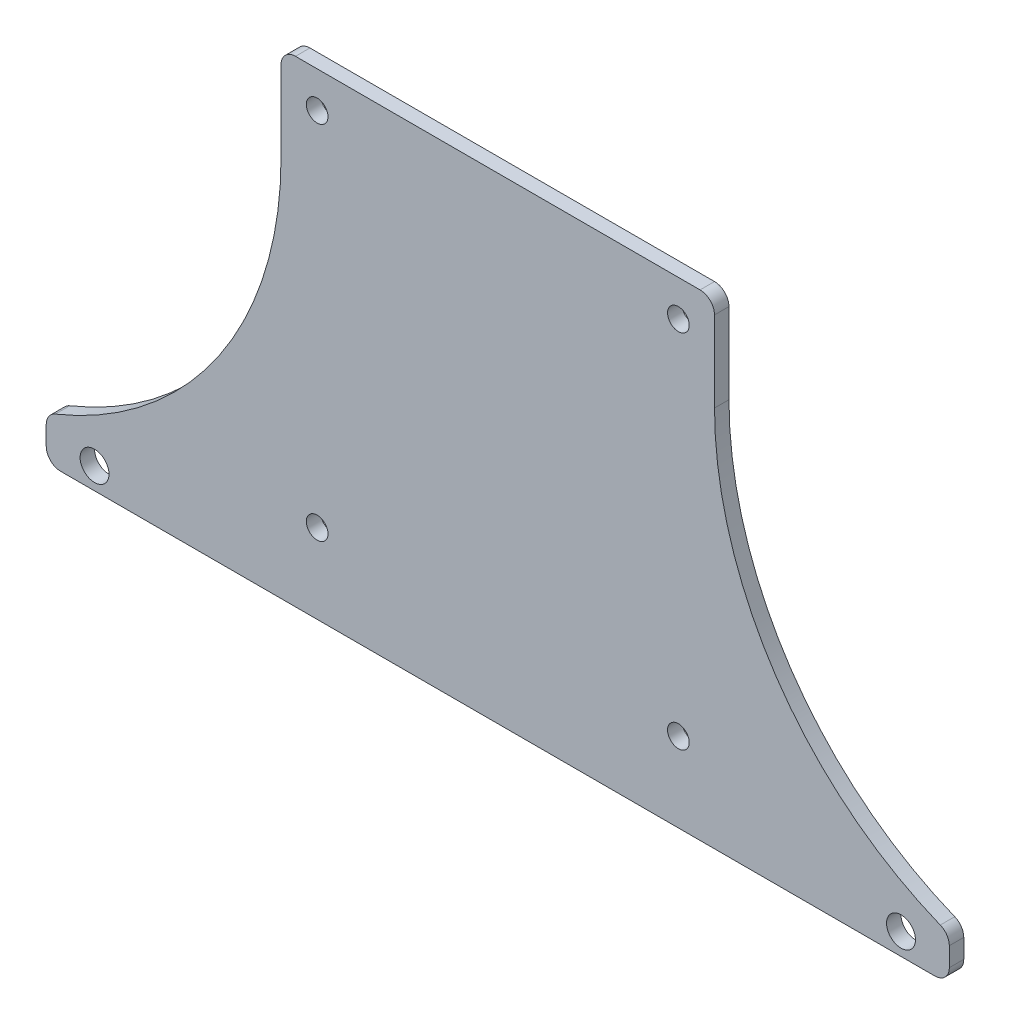
ISO-10303-21;
HEADER;
FILE_DESCRIPTION(('STEP AP214'),'2;1');
FILE_NAME('part.step','',(''),(''),'','','');
FILE_SCHEMA(('AUTOMOTIVE_DESIGN { 1 0 10303 214 1 1 1 1 }'));
ENDSEC;
DATA;
#1=APPLICATION_CONTEXT('core data for automotive mechanical design processes');
#2=APPLICATION_PROTOCOL_DEFINITION('international standard','automotive_design',2000,#1);
#3=PRODUCT_CONTEXT('',#1,'mechanical');
#4=PRODUCT('Part','Part','',(#3));
#5=PRODUCT_RELATED_PRODUCT_CATEGORY('part','',(#4));
#6=PRODUCT_DEFINITION_FORMATION('','',#4);
#7=PRODUCT_DEFINITION_CONTEXT('part definition',#1,'design');
#8=PRODUCT_DEFINITION('design','',#6,#7);
#9=PRODUCT_DEFINITION_SHAPE('','',#8);
#10=(LENGTH_UNIT() NAMED_UNIT(*) SI_UNIT(.MILLI.,.METRE.));
#11=(NAMED_UNIT(*) PLANE_ANGLE_UNIT() SI_UNIT($,.RADIAN.));
#12=(NAMED_UNIT(*) SI_UNIT($,.STERADIAN.) SOLID_ANGLE_UNIT());
#13=UNCERTAINTY_MEASURE_WITH_UNIT(LENGTH_MEASURE(1.E-05),#10,'distance_accuracy_value','');
#14=(GEOMETRIC_REPRESENTATION_CONTEXT(3) GLOBAL_UNCERTAINTY_ASSIGNED_CONTEXT((#13)) GLOBAL_UNIT_ASSIGNED_CONTEXT((#10,
#11,#12)) REPRESENTATION_CONTEXT('',''));
#15=CARTESIAN_POINT('',(0.,0.,0.));
#16=DIRECTION('',(0.,0.,1.));
#17=DIRECTION('',(1.,0.,0.));
#18=AXIS2_PLACEMENT_3D('',#15,#16,#17);
#19=CARTESIAN_POINT('',(0.,0.,2.));
#20=DIRECTION('',(0.,0.,-1.));
#21=DIRECTION('',(-1.,0.,0.));
#22=AXIS2_PLACEMENT_3D('',#19,#20,#21);
#23=PLANE('',#22);
#24=DIRECTION('',(-1.,0.,0.));
#25=VECTOR('',#24,1.);
#26=CARTESIAN_POINT('',(0.,60.,2.));
#27=LINE('',#26,#25);
#28=CARTESIAN_POINT('',(58.,60.,2.));
#29=VERTEX_POINT('',#28);
#30=CARTESIAN_POINT('',(2.,60.,2.));
#31=VERTEX_POINT('',#30);
#32=EDGE_CURVE('E157',#29,#31,#27,.T.);
#33=ORIENTED_EDGE('',*,*,#32,.T.);
#34=CARTESIAN_POINT('',(2.,58.,2.));
#35=DIRECTION('',(0.,0.,-1.));
#36=DIRECTION('',(-1.,0.,0.));
#37=AXIS2_PLACEMENT_3D('',#34,#35,#36);
#38=CIRCLE('',#37,2.);
#39=CARTESIAN_POINT('',(0.,58.,2.));
#40=VERTEX_POINT('',#39);
#41=EDGE_CURVE('E211',#31,#40,#38,.F.);
#42=ORIENTED_EDGE('',*,*,#41,.T.);
#43=DIRECTION('',(0.,-1.,0.));
#44=VECTOR('',#43,1.);
#45=CARTESIAN_POINT('',(0.,0.,2.));
#46=LINE('',#45,#44);
#47=CARTESIAN_POINT('',(0.,46.837484987988,2.));
#48=VERTEX_POINT('',#47);
#49=EDGE_CURVE('E168',#40,#48,#46,.T.);
#50=ORIENTED_EDGE('',*,*,#49,.T.);
#51=CARTESIAN_POINT('',(-50.,46.837484987988,2.));
#52=DIRECTION('',(0.,0.,-1.));
#53=DIRECTION('',(-1.,0.,0.));
#54=AXIS2_PLACEMENT_3D('',#51,#52,#53);
#55=CIRCLE('',#54,50.);
#56=CARTESIAN_POINT('',(-31.25,0.486244443640094,2.));
#57=VERTEX_POINT('',#56);
#58=EDGE_CURVE('E180',#48,#57,#55,.T.);
#59=ORIENTED_EDGE('',*,*,#58,.T.);
#60=CARTESIAN_POINT('',(-30.5,-1.36780517813383,2.));
#61=DIRECTION('',(0.,0.,-1.));
#62=DIRECTION('',(-1.,0.,0.));
#63=AXIS2_PLACEMENT_3D('',#60,#61,#62);
#64=CIRCLE('',#63,2.);
#65=CARTESIAN_POINT('',(-32.5,-1.36780517813383,2.));
#66=VERTEX_POINT('',#65);
#67=EDGE_CURVE('E202',#57,#66,#64,.F.);
#68=ORIENTED_EDGE('',*,*,#67,.T.);
#69=DIRECTION('',(0.,-1.,0.));
#70=VECTOR('',#69,1.);
#71=CARTESIAN_POINT('',(-32.5,-6.,2.));
#72=LINE('',#71,#70);
#73=CARTESIAN_POINT('',(-32.5,-4.,2.));
#74=VERTEX_POINT('',#73);
#75=EDGE_CURVE('E233',#66,#74,#72,.T.);
#76=ORIENTED_EDGE('',*,*,#75,.T.);
#77=CARTESIAN_POINT('',(-30.5,-4.,2.));
#78=DIRECTION('',(0.,0.,-1.));
#79=DIRECTION('',(-1.,0.,0.));
#80=AXIS2_PLACEMENT_3D('',#77,#78,#79);
#81=CIRCLE('',#80,2.);
#82=CARTESIAN_POINT('',(-30.5,-6.,2.));
#83=VERTEX_POINT('',#82);
#84=EDGE_CURVE('E204',#74,#83,#81,.F.);
#85=ORIENTED_EDGE('',*,*,#84,.T.);
#86=DIRECTION('',(1.,0.,0.));
#87=VECTOR('',#86,1.);
#88=CARTESIAN_POINT('',(-32.5,-6.,2.));
#89=LINE('',#88,#87);
#90=CARTESIAN_POINT('',(90.5,-5.99999999999998,2.));
#91=VERTEX_POINT('',#90);
#92=EDGE_CURVE('E243',#83,#91,#89,.T.);
#93=ORIENTED_EDGE('',*,*,#92,.T.);
#94=CARTESIAN_POINT('',(90.5,-3.99999999999998,2.));
#95=DIRECTION('',(0.,0.,-1.));
#96=DIRECTION('',(-1.,0.,0.));
#97=AXIS2_PLACEMENT_3D('',#94,#95,#96);
#98=CIRCLE('',#97,2.);
#99=CARTESIAN_POINT('',(92.5,-3.99999999999998,2.));
#100=VERTEX_POINT('',#99);
#101=EDGE_CURVE('E207',#91,#100,#98,.F.);
#102=ORIENTED_EDGE('',*,*,#101,.T.);
#103=DIRECTION('',(0.,1.,0.));
#104=VECTOR('',#103,1.);
#105=CARTESIAN_POINT('',(92.5,-5.99999999999998,2.));
#106=LINE('',#105,#104);
#107=CARTESIAN_POINT('',(92.5,-1.36780517813381,2.));
#108=VERTEX_POINT('',#107);
#109=EDGE_CURVE('E246',#100,#108,#106,.T.);
#110=ORIENTED_EDGE('',*,*,#109,.T.);
#111=CARTESIAN_POINT('',(90.5,-1.36780517813381,2.));
#112=DIRECTION('',(0.,0.,-1.));
#113=DIRECTION('',(-1.,0.,0.));
#114=AXIS2_PLACEMENT_3D('',#111,#112,#113);
#115=CIRCLE('',#114,2.);
#116=CARTESIAN_POINT('',(91.25,0.486244443640108,2.));
#117=VERTEX_POINT('',#116);
#118=EDGE_CURVE('E62',#108,#117,#115,.F.);
#119=ORIENTED_EDGE('',*,*,#118,.T.);
#120=CARTESIAN_POINT('',(110.,46.837484987988,2.));
#121=DIRECTION('',(0.,0.,-1.));
#122=DIRECTION('',(-1.,0.,0.));
#123=AXIS2_PLACEMENT_3D('',#120,#121,#122);
#124=CIRCLE('',#123,50.);
#125=CARTESIAN_POINT('',(60.,46.837484987988,2.));
#126=VERTEX_POINT('',#125);
#127=EDGE_CURVE('E151',#117,#126,#124,.T.);
#128=ORIENTED_EDGE('',*,*,#127,.T.);
#129=DIRECTION('',(0.,1.,0.));
#130=VECTOR('',#129,1.);
#131=CARTESIAN_POINT('',(60.,0.,2.));
#132=LINE('',#131,#130);
#133=CARTESIAN_POINT('',(60.,58.,2.));
#134=VERTEX_POINT('',#133);
#135=EDGE_CURVE('E156',#126,#134,#132,.T.);
#136=ORIENTED_EDGE('',*,*,#135,.T.);
#137=CARTESIAN_POINT('',(58.,58.,2.));
#138=DIRECTION('',(0.,0.,-1.));
#139=DIRECTION('',(-1.,0.,0.));
#140=AXIS2_PLACEMENT_3D('',#137,#138,#139);
#141=CIRCLE('',#140,2.);
#142=EDGE_CURVE('E209',#134,#29,#141,.F.);
#143=ORIENTED_EDGE('',*,*,#142,.T.);
#144=EDGE_LOOP('',(#33,#42,#50,#59,#68,#76,#85,#93,#102,#110,#119,#128,#136,#143));
#145=FACE_BOUND('',#144,.T.);
#146=CARTESIAN_POINT('',(5.,55.,2.));
#147=DIRECTION('',(0.,0.,1.));
#148=DIRECTION('',(1.,0.,0.));
#149=AXIS2_PLACEMENT_3D('',#146,#147,#148);
#150=CIRCLE('',#149,1.5);
#151=CARTESIAN_POINT('',(6.5,55.,2.));
#152=VERTEX_POINT('',#151);
#153=EDGE_CURVE('E171',#152,#152,#150,.T.);
#154=ORIENTED_EDGE('',*,*,#153,.F.);
#155=EDGE_LOOP('',(#154));
#156=FACE_BOUND('',#155,.T.);
#157=CARTESIAN_POINT('',(55.,55.,2.));
#158=DIRECTION('',(0.,0.,1.));
#159=DIRECTION('',(-1.,0.,0.));
#160=AXIS2_PLACEMENT_3D('',#157,#158,#159);
#161=CIRCLE('',#160,1.5);
#162=CARTESIAN_POINT('',(53.5,55.,2.));
#163=VERTEX_POINT('',#162);
#164=EDGE_CURVE('E269',#163,#163,#161,.T.);
#165=ORIENTED_EDGE('',*,*,#164,.F.);
#166=EDGE_LOOP('',(#165));
#167=FACE_BOUND('',#166,.T.);
#168=CARTESIAN_POINT('',(55.,5.00000000000001,2.));
#169=DIRECTION('',(0.,0.,1.));
#170=DIRECTION('',(1.,0.,0.));
#171=AXIS2_PLACEMENT_3D('',#168,#169,#170);
#172=CIRCLE('',#171,1.5);
#173=CARTESIAN_POINT('',(56.5,5.00000000000001,2.));
#174=VERTEX_POINT('',#173);
#175=EDGE_CURVE('E263',#174,#174,#172,.T.);
#176=ORIENTED_EDGE('',*,*,#175,.F.);
#177=EDGE_LOOP('',(#176));
#178=FACE_BOUND('',#177,.T.);
#179=CARTESIAN_POINT('',(5.,5.,2.));
#180=DIRECTION('',(0.,0.,1.));
#181=DIRECTION('',(-1.,0.,0.));
#182=AXIS2_PLACEMENT_3D('',#179,#180,#181);
#183=CIRCLE('',#182,1.5);
#184=CARTESIAN_POINT('',(3.5,5.,2.));
#185=VERTEX_POINT('',#184);
#186=EDGE_CURVE('E256',#185,#185,#183,.T.);
#187=ORIENTED_EDGE('',*,*,#186,.F.);
#188=EDGE_LOOP('',(#187));
#189=FACE_BOUND('',#188,.T.);
#190=CARTESIAN_POINT('',(85.815,-2.99999999999999,2.));
#191=DIRECTION('',(0.,0.,1.));
#192=DIRECTION('',(-1.,0.,0.));
#193=AXIS2_PLACEMENT_3D('',#190,#191,#192);
#194=CIRCLE('',#193,2.);
#195=CARTESIAN_POINT('',(83.815,-2.99999999999999,2.));
#196=VERTEX_POINT('',#195);
#197=EDGE_CURVE('E308',#196,#196,#194,.T.);
#198=ORIENTED_EDGE('',*,*,#197,.F.);
#199=EDGE_LOOP('',(#198));
#200=FACE_BOUND('',#199,.T.);
#201=CARTESIAN_POINT('',(-25.815,-3.,2.));
#202=DIRECTION('',(0.,0.,1.));
#203=DIRECTION('',(1.,0.,0.));
#204=AXIS2_PLACEMENT_3D('',#201,#202,#203);
#205=CIRCLE('',#204,2.);
#206=CARTESIAN_POINT('',(-23.815,-3.,2.));
#207=VERTEX_POINT('',#206);
#208=EDGE_CURVE('E249',#207,#207,#205,.T.);
#209=ORIENTED_EDGE('',*,*,#208,.F.);
#210=EDGE_LOOP('',(#209));
#211=FACE_BOUND('',#210,.T.);
#212=ADVANCED_FACE('F39',(#145,#156,#167,#178,#189,#200,#211),#23,.F.);
#213=CARTESIAN_POINT('',(0.,0.,0.));
#214=DIRECTION('',(0.,0.,-1.));
#215=DIRECTION('',(-1.,0.,0.));
#216=AXIS2_PLACEMENT_3D('',#213,#214,#215);
#217=PLANE('',#216);
#218=CARTESIAN_POINT('',(55.,5.00000000000001,0.));
#219=DIRECTION('',(0.,0.,1.));
#220=DIRECTION('',(1.,0.,0.));
#221=AXIS2_PLACEMENT_3D('',#218,#219,#220);
#222=CIRCLE('',#221,1.5);
#223=CARTESIAN_POINT('',(56.5,5.00000000000001,0.));
#224=VERTEX_POINT('',#223);
#225=EDGE_CURVE('E259',#224,#224,#222,.T.);
#226=ORIENTED_EDGE('',*,*,#225,.T.);
#227=EDGE_LOOP('',(#226));
#228=FACE_BOUND('',#227,.T.);
#229=CARTESIAN_POINT('',(5.,55.,0.));
#230=DIRECTION('',(0.,0.,1.));
#231=DIRECTION('',(1.,0.,0.));
#232=AXIS2_PLACEMENT_3D('',#229,#230,#231);
#233=CIRCLE('',#232,1.5);
#234=CARTESIAN_POINT('',(6.5,55.,0.));
#235=VERTEX_POINT('',#234);
#236=EDGE_CURVE('E272',#235,#235,#233,.T.);
#237=ORIENTED_EDGE('',*,*,#236,.T.);
#238=EDGE_LOOP('',(#237));
#239=FACE_BOUND('',#238,.T.);
#240=DIRECTION('',(0.,-1.,0.));
#241=VECTOR('',#240,1.);
#242=CARTESIAN_POINT('',(0.,0.,0.));
#243=LINE('',#242,#241);
#244=CARTESIAN_POINT('',(0.,58.,0.));
#245=VERTEX_POINT('',#244);
#246=CARTESIAN_POINT('',(0.,46.837484987988,0.));
#247=VERTEX_POINT('',#246);
#248=EDGE_CURVE('E165',#245,#247,#243,.T.);
#249=ORIENTED_EDGE('',*,*,#248,.F.);
#250=CARTESIAN_POINT('',(2.,58.,0.));
#251=DIRECTION('',(0.,0.,-1.));
#252=DIRECTION('',(-1.,0.,0.));
#253=AXIS2_PLACEMENT_3D('',#250,#251,#252);
#254=CIRCLE('',#253,2.);
#255=CARTESIAN_POINT('',(2.,60.,0.));
#256=VERTEX_POINT('',#255);
#257=EDGE_CURVE('E195',#245,#256,#254,.T.);
#258=ORIENTED_EDGE('',*,*,#257,.T.);
#259=DIRECTION('',(-1.,0.,0.));
#260=VECTOR('',#259,1.);
#261=CARTESIAN_POINT('',(0.,60.,0.));
#262=LINE('',#261,#260);
#263=CARTESIAN_POINT('',(58.,60.,0.));
#264=VERTEX_POINT('',#263);
#265=EDGE_CURVE('E164',#264,#256,#262,.T.);
#266=ORIENTED_EDGE('',*,*,#265,.F.);
#267=CARTESIAN_POINT('',(58.,58.,0.));
#268=DIRECTION('',(0.,0.,-1.));
#269=DIRECTION('',(-1.,0.,0.));
#270=AXIS2_PLACEMENT_3D('',#267,#268,#269);
#271=CIRCLE('',#270,2.);
#272=CARTESIAN_POINT('',(60.,58.,0.));
#273=VERTEX_POINT('',#272);
#274=EDGE_CURVE('E163',#264,#273,#271,.T.);
#275=ORIENTED_EDGE('',*,*,#274,.T.);
#276=DIRECTION('',(0.,1.,0.));
#277=VECTOR('',#276,1.);
#278=CARTESIAN_POINT('',(60.,0.,0.));
#279=LINE('',#278,#277);
#280=CARTESIAN_POINT('',(60.,46.837484987988,0.));
#281=VERTEX_POINT('',#280);
#282=EDGE_CURVE('E155',#281,#273,#279,.T.);
#283=ORIENTED_EDGE('',*,*,#282,.F.);
#284=CARTESIAN_POINT('',(110.,46.837484987988,0.));
#285=DIRECTION('',(0.,0.,-1.));
#286=DIRECTION('',(-1.,0.,0.));
#287=AXIS2_PLACEMENT_3D('',#284,#285,#286);
#288=CIRCLE('',#287,50.);
#289=CARTESIAN_POINT('',(91.25,0.486244443640108,0.));
#290=VERTEX_POINT('',#289);
#291=EDGE_CURVE('E142',#281,#290,#288,.F.);
#292=ORIENTED_EDGE('',*,*,#291,.T.);
#293=CARTESIAN_POINT('',(90.5,-1.36780517813381,0.));
#294=DIRECTION('',(0.,0.,-1.));
#295=DIRECTION('',(-1.,0.,0.));
#296=AXIS2_PLACEMENT_3D('',#293,#294,#295);
#297=CIRCLE('',#296,2.);
#298=CARTESIAN_POINT('',(92.5,-1.36780517813381,0.));
#299=VERTEX_POINT('',#298);
#300=EDGE_CURVE('E190',#290,#299,#297,.T.);
#301=ORIENTED_EDGE('',*,*,#300,.T.);
#302=DIRECTION('',(0.,1.,0.));
#303=VECTOR('',#302,1.);
#304=CARTESIAN_POINT('',(92.5,-5.99999999999998,0.));
#305=LINE('',#304,#303);
#306=CARTESIAN_POINT('',(92.5,-3.99999999999998,0.));
#307=VERTEX_POINT('',#306);
#308=EDGE_CURVE('E252',#307,#299,#305,.T.);
#309=ORIENTED_EDGE('',*,*,#308,.F.);
#310=CARTESIAN_POINT('',(90.5,-3.99999999999998,0.));
#311=DIRECTION('',(0.,0.,-1.));
#312=DIRECTION('',(-1.,0.,0.));
#313=AXIS2_PLACEMENT_3D('',#310,#311,#312);
#314=CIRCLE('',#313,2.);
#315=CARTESIAN_POINT('',(90.5,-5.99999999999998,0.));
#316=VERTEX_POINT('',#315);
#317=EDGE_CURVE('E192',#307,#316,#314,.T.);
#318=ORIENTED_EDGE('',*,*,#317,.T.);
#319=DIRECTION('',(1.,0.,0.));
#320=VECTOR('',#319,1.);
#321=CARTESIAN_POINT('',(-32.5,-6.,0.));
#322=LINE('',#321,#320);
#323=CARTESIAN_POINT('',(-30.5,-6.,0.));
#324=VERTEX_POINT('',#323);
#325=EDGE_CURVE('E301',#324,#316,#322,.T.);
#326=ORIENTED_EDGE('',*,*,#325,.F.);
#327=CARTESIAN_POINT('',(-30.5,-4.,0.));
#328=DIRECTION('',(0.,0.,-1.));
#329=DIRECTION('',(-1.,0.,0.));
#330=AXIS2_PLACEMENT_3D('',#327,#328,#329);
#331=CIRCLE('',#330,2.);
#332=CARTESIAN_POINT('',(-32.5,-4.,0.));
#333=VERTEX_POINT('',#332);
#334=EDGE_CURVE('E188',#324,#333,#331,.T.);
#335=ORIENTED_EDGE('',*,*,#334,.T.);
#336=DIRECTION('',(0.,-1.,0.));
#337=VECTOR('',#336,1.);
#338=CARTESIAN_POINT('',(-32.5,-6.,0.));
#339=LINE('',#338,#337);
#340=CARTESIAN_POINT('',(-32.5,-1.36780517813383,0.));
#341=VERTEX_POINT('',#340);
#342=EDGE_CURVE('E236',#341,#333,#339,.T.);
#343=ORIENTED_EDGE('',*,*,#342,.F.);
#344=CARTESIAN_POINT('',(-30.5,-1.36780517813383,0.));
#345=DIRECTION('',(0.,0.,-1.));
#346=DIRECTION('',(-1.,0.,0.));
#347=AXIS2_PLACEMENT_3D('',#344,#345,#346);
#348=CIRCLE('',#347,2.);
#349=CARTESIAN_POINT('',(-31.25,0.486244443640094,0.));
#350=VERTEX_POINT('',#349);
#351=EDGE_CURVE('E186',#341,#350,#348,.T.);
#352=ORIENTED_EDGE('',*,*,#351,.T.);
#353=CARTESIAN_POINT('',(-50.,46.837484987988,0.));
#354=DIRECTION('',(0.,0.,-1.));
#355=DIRECTION('',(-1.,0.,0.));
#356=AXIS2_PLACEMENT_3D('',#353,#354,#355);
#357=CIRCLE('',#356,50.);
#358=EDGE_CURVE('E178',#350,#247,#357,.F.);
#359=ORIENTED_EDGE('',*,*,#358,.T.);
#360=EDGE_LOOP('',(#249,#258,#266,#275,#283,#292,#301,#309,#318,#326,#335,#343,#352,#359));
#361=FACE_BOUND('',#360,.T.);
#362=CARTESIAN_POINT('',(55.,55.,0.));
#363=DIRECTION('',(0.,0.,1.));
#364=DIRECTION('',(-1.,0.,0.));
#365=AXIS2_PLACEMENT_3D('',#362,#363,#364);
#366=CIRCLE('',#365,1.5);
#367=CARTESIAN_POINT('',(53.5,55.,0.));
#368=VERTEX_POINT('',#367);
#369=EDGE_CURVE('E266',#368,#368,#366,.T.);
#370=ORIENTED_EDGE('',*,*,#369,.T.);
#371=EDGE_LOOP('',(#370));
#372=FACE_BOUND('',#371,.T.);
#373=CARTESIAN_POINT('',(5.,5.,0.));
#374=DIRECTION('',(0.,0.,1.));
#375=DIRECTION('',(-1.,0.,0.));
#376=AXIS2_PLACEMENT_3D('',#373,#374,#375);
#377=CIRCLE('',#376,1.5);
#378=CARTESIAN_POINT('',(3.5,5.,0.));
#379=VERTEX_POINT('',#378);
#380=EDGE_CURVE('E260',#379,#379,#377,.T.);
#381=ORIENTED_EDGE('',*,*,#380,.T.);
#382=EDGE_LOOP('',(#381));
#383=FACE_BOUND('',#382,.T.);
#384=CARTESIAN_POINT('',(85.815,-2.99999999999999,0.));
#385=DIRECTION('',(0.,0.,1.));
#386=DIRECTION('',(-1.,0.,0.));
#387=AXIS2_PLACEMENT_3D('',#384,#385,#386);
#388=CIRCLE('',#387,2.);
#389=CARTESIAN_POINT('',(83.815,-2.99999999999999,0.));
#390=VERTEX_POINT('',#389);
#391=EDGE_CURVE('E306',#390,#390,#388,.T.);
#392=ORIENTED_EDGE('',*,*,#391,.T.);
#393=EDGE_LOOP('',(#392));
#394=FACE_BOUND('',#393,.T.);
#395=CARTESIAN_POINT('',(-25.815,-3.,0.));
#396=DIRECTION('',(0.,0.,1.));
#397=DIRECTION('',(1.,0.,0.));
#398=AXIS2_PLACEMENT_3D('',#395,#396,#397);
#399=CIRCLE('',#398,2.);
#400=CARTESIAN_POINT('',(-23.815,-3.,0.));
#401=VERTEX_POINT('',#400);
#402=EDGE_CURVE('E244',#401,#401,#399,.T.);
#403=ORIENTED_EDGE('',*,*,#402,.T.);
#404=EDGE_LOOP('',(#403));
#405=FACE_BOUND('',#404,.T.);
#406=ADVANCED_FACE('F160',(#228,#239,#361,#372,#383,#394,#405),#217,.T.);
#407=CARTESIAN_POINT('',(0.,0.,2.));
#408=DIRECTION('',(1.,0.,0.));
#409=DIRECTION('',(0.,0.,-1.));
#410=AXIS2_PLACEMENT_3D('',#407,#408,#409);
#411=PLANE('',#410);
#412=ORIENTED_EDGE('',*,*,#49,.F.);
#413=DIRECTION('',(0.,0.,-1.));
#414=VECTOR('',#413,1.);
#415=CARTESIAN_POINT('',(0.,58.,2.));
#416=LINE('',#415,#414);
#417=EDGE_CURVE('E183',#40,#245,#416,.T.);
#418=ORIENTED_EDGE('',*,*,#417,.T.);
#419=ORIENTED_EDGE('',*,*,#248,.T.);
#420=DIRECTION('',(0.,0.,1.));
#421=VECTOR('',#420,1.);
#422=CARTESIAN_POINT('',(0.,46.837484987988,2.));
#423=LINE('',#422,#421);
#424=EDGE_CURVE('E152',#247,#48,#423,.T.);
#425=ORIENTED_EDGE('',*,*,#424,.T.);
#426=EDGE_LOOP('',(#412,#418,#419,#425));
#427=FACE_BOUND('',#426,.T.);
#428=ADVANCED_FACE('F291',(#427),#411,.F.);
#429=CARTESIAN_POINT('',(60.,0.,2.));
#430=DIRECTION('',(-1.,0.,0.));
#431=DIRECTION('',(0.,0.,1.));
#432=AXIS2_PLACEMENT_3D('',#429,#430,#431);
#433=PLANE('',#432);
#434=ORIENTED_EDGE('',*,*,#282,.T.);
#435=DIRECTION('',(0.,0.,-1.));
#436=VECTOR('',#435,1.);
#437=CARTESIAN_POINT('',(60.,58.,2.));
#438=LINE('',#437,#436);
#439=EDGE_CURVE('E54',#273,#134,#438,.F.);
#440=ORIENTED_EDGE('',*,*,#439,.T.);
#441=ORIENTED_EDGE('',*,*,#135,.F.);
#442=DIRECTION('',(0.,0.,-1.));
#443=VECTOR('',#442,1.);
#444=CARTESIAN_POINT('',(60.,46.837484987988,2.));
#445=LINE('',#444,#443);
#446=EDGE_CURVE('E145',#126,#281,#445,.T.);
#447=ORIENTED_EDGE('',*,*,#446,.T.);
#448=EDGE_LOOP('',(#434,#440,#441,#447));
#449=FACE_BOUND('',#448,.T.);
#450=ADVANCED_FACE('F154',(#449),#433,.F.);
#451=CARTESIAN_POINT('',(0.,60.,2.));
#452=DIRECTION('',(0.,-1.,0.));
#453=DIRECTION('',(0.,0.,-1.));
#454=AXIS2_PLACEMENT_3D('',#451,#452,#453);
#455=PLANE('',#454);
#456=ORIENTED_EDGE('',*,*,#265,.T.);
#457=DIRECTION('',(0.,0.,-1.));
#458=VECTOR('',#457,1.);
#459=CARTESIAN_POINT('',(2.,60.,2.));
#460=LINE('',#459,#458);
#461=EDGE_CURVE('E200',#256,#31,#460,.F.);
#462=ORIENTED_EDGE('',*,*,#461,.T.);
#463=ORIENTED_EDGE('',*,*,#32,.F.);
#464=DIRECTION('',(0.,0.,-1.));
#465=VECTOR('',#464,1.);
#466=CARTESIAN_POINT('',(58.,60.,2.));
#467=LINE('',#466,#465);
#468=EDGE_CURVE('E197',#29,#264,#467,.T.);
#469=ORIENTED_EDGE('',*,*,#468,.T.);
#470=EDGE_LOOP('',(#456,#462,#463,#469));
#471=FACE_BOUND('',#470,.T.);
#472=ADVANCED_FACE('F359',(#471),#455,.F.);
#473=CARTESIAN_POINT('',(5.,55.,2.));
#474=DIRECTION('',(0.,0.,-1.));
#475=DIRECTION('',(-1.,0.,0.));
#476=AXIS2_PLACEMENT_3D('',#473,#474,#475);
#477=CYLINDRICAL_SURFACE('',#476,1.5);
#478=ORIENTED_EDGE('',*,*,#153,.T.);
#479=EDGE_LOOP('',(#478));
#480=FACE_BOUND('',#479,.T.);
#481=ORIENTED_EDGE('',*,*,#236,.F.);
#482=EDGE_LOOP('',(#481));
#483=FACE_BOUND('',#482,.T.);
#484=ADVANCED_FACE('F356',(#480,#483),#477,.F.);
#485=CARTESIAN_POINT('',(55.,55.,2.));
#486=DIRECTION('',(0.,0.,-1.));
#487=DIRECTION('',(-1.,0.,0.));
#488=AXIS2_PLACEMENT_3D('',#485,#486,#487);
#489=CYLINDRICAL_SURFACE('',#488,1.5);
#490=ORIENTED_EDGE('',*,*,#164,.T.);
#491=EDGE_LOOP('',(#490));
#492=FACE_BOUND('',#491,.T.);
#493=ORIENTED_EDGE('',*,*,#369,.F.);
#494=EDGE_LOOP('',(#493));
#495=FACE_BOUND('',#494,.T.);
#496=ADVANCED_FACE('F352',(#492,#495),#489,.F.);
#497=CARTESIAN_POINT('',(55.,5.00000000000001,2.));
#498=DIRECTION('',(0.,0.,-1.));
#499=DIRECTION('',(-1.,0.,0.));
#500=AXIS2_PLACEMENT_3D('',#497,#498,#499);
#501=CYLINDRICAL_SURFACE('',#500,1.5);
#502=ORIENTED_EDGE('',*,*,#175,.T.);
#503=EDGE_LOOP('',(#502));
#504=FACE_BOUND('',#503,.T.);
#505=ORIENTED_EDGE('',*,*,#225,.F.);
#506=EDGE_LOOP('',(#505));
#507=FACE_BOUND('',#506,.T.);
#508=ADVANCED_FACE('F348',(#504,#507),#501,.F.);
#509=CARTESIAN_POINT('',(5.,5.,2.));
#510=DIRECTION('',(0.,0.,-1.));
#511=DIRECTION('',(-1.,0.,0.));
#512=AXIS2_PLACEMENT_3D('',#509,#510,#511);
#513=CYLINDRICAL_SURFACE('',#512,1.5);
#514=ORIENTED_EDGE('',*,*,#186,.T.);
#515=EDGE_LOOP('',(#514));
#516=FACE_BOUND('',#515,.T.);
#517=ORIENTED_EDGE('',*,*,#380,.F.);
#518=EDGE_LOOP('',(#517));
#519=FACE_BOUND('',#518,.T.);
#520=ADVANCED_FACE('F345',(#516,#519),#513,.F.);
#521=CARTESIAN_POINT('',(-32.5,-6.,0.));
#522=DIRECTION('',(-1.,0.,0.));
#523=DIRECTION('',(0.,0.,1.));
#524=AXIS2_PLACEMENT_3D('',#521,#522,#523);
#525=PLANE('',#524);
#526=ORIENTED_EDGE('',*,*,#342,.T.);
#527=DIRECTION('',(0.,0.,1.));
#528=VECTOR('',#527,1.);
#529=CARTESIAN_POINT('',(-32.5,-4.,0.));
#530=LINE('',#529,#528);
#531=EDGE_CURVE('E47',#333,#74,#530,.T.);
#532=ORIENTED_EDGE('',*,*,#531,.T.);
#533=ORIENTED_EDGE('',*,*,#75,.F.);
#534=DIRECTION('',(0.,0.,-1.));
#535=VECTOR('',#534,1.);
#536=CARTESIAN_POINT('',(-32.5,-1.36780517813383,0.));
#537=LINE('',#536,#535);
#538=EDGE_CURVE('E225',#66,#341,#537,.T.);
#539=ORIENTED_EDGE('',*,*,#538,.T.);
#540=EDGE_LOOP('',(#526,#532,#533,#539));
#541=FACE_BOUND('',#540,.T.);
#542=ADVANCED_FACE('F232',(#541),#525,.T.);
#543=CARTESIAN_POINT('',(92.5,-5.99999999999998,0.));
#544=DIRECTION('',(1.,0.,0.));
#545=DIRECTION('',(0.,0.,-1.));
#546=AXIS2_PLACEMENT_3D('',#543,#544,#545);
#547=PLANE('',#546);
#548=ORIENTED_EDGE('',*,*,#109,.F.);
#549=DIRECTION('',(0.,0.,1.));
#550=VECTOR('',#549,1.);
#551=CARTESIAN_POINT('',(92.5,-3.99999999999998,0.));
#552=LINE('',#551,#550);
#553=EDGE_CURVE('E222',#100,#307,#552,.F.);
#554=ORIENTED_EDGE('',*,*,#553,.T.);
#555=ORIENTED_EDGE('',*,*,#308,.T.);
#556=DIRECTION('',(0.,0.,1.));
#557=VECTOR('',#556,1.);
#558=CARTESIAN_POINT('',(92.5,-1.36780517813381,2.));
#559=LINE('',#558,#557);
#560=EDGE_CURVE('E219',#299,#108,#559,.T.);
#561=ORIENTED_EDGE('',*,*,#560,.T.);
#562=EDGE_LOOP('',(#548,#554,#555,#561));
#563=FACE_BOUND('',#562,.T.);
#564=ADVANCED_FACE('F335',(#563),#547,.T.);
#565=CARTESIAN_POINT('',(-32.5,-6.,0.));
#566=DIRECTION('',(0.,-1.,0.));
#567=DIRECTION('',(1.,0.,0.));
#568=AXIS2_PLACEMENT_3D('',#565,#566,#567);
#569=PLANE('',#568);
#570=ORIENTED_EDGE('',*,*,#325,.T.);
#571=DIRECTION('',(0.,0.,1.));
#572=VECTOR('',#571,1.);
#573=CARTESIAN_POINT('',(90.5,-5.99999999999998,0.));
#574=LINE('',#573,#572);
#575=EDGE_CURVE('E216',#316,#91,#574,.T.);
#576=ORIENTED_EDGE('',*,*,#575,.T.);
#577=ORIENTED_EDGE('',*,*,#92,.F.);
#578=DIRECTION('',(0.,0.,1.));
#579=VECTOR('',#578,1.);
#580=CARTESIAN_POINT('',(-30.5,-6.,0.));
#581=LINE('',#580,#579);
#582=EDGE_CURVE('E214',#83,#324,#581,.F.);
#583=ORIENTED_EDGE('',*,*,#582,.T.);
#584=EDGE_LOOP('',(#570,#576,#577,#583));
#585=FACE_BOUND('',#584,.T.);
#586=ADVANCED_FACE('F329',(#585),#569,.T.);
#587=CARTESIAN_POINT('',(-25.815,-3.,0.));
#588=DIRECTION('',(0.,0.,1.));
#589=DIRECTION('',(1.,0.,0.));
#590=AXIS2_PLACEMENT_3D('',#587,#588,#589);
#591=CYLINDRICAL_SURFACE('',#590,2.);
#592=ORIENTED_EDGE('',*,*,#402,.F.);
#593=EDGE_LOOP('',(#592));
#594=FACE_BOUND('',#593,.T.);
#595=ORIENTED_EDGE('',*,*,#208,.T.);
#596=EDGE_LOOP('',(#595));
#597=FACE_BOUND('',#596,.T.);
#598=ADVANCED_FACE('F319',(#594,#597),#591,.F.);
#599=CARTESIAN_POINT('',(85.815,-2.99999999999999,0.));
#600=DIRECTION('',(0.,0.,1.));
#601=DIRECTION('',(1.,0.,0.));
#602=AXIS2_PLACEMENT_3D('',#599,#600,#601);
#603=CYLINDRICAL_SURFACE('',#602,2.);
#604=ORIENTED_EDGE('',*,*,#391,.F.);
#605=EDGE_LOOP('',(#604));
#606=FACE_BOUND('',#605,.T.);
#607=ORIENTED_EDGE('',*,*,#197,.T.);
#608=EDGE_LOOP('',(#607));
#609=FACE_BOUND('',#608,.T.);
#610=ADVANCED_FACE('F316',(#606,#609),#603,.F.);
#611=CARTESIAN_POINT('',(110.,46.837484987988,0.));
#612=DIRECTION('',(0.,0.,-1.));
#613=DIRECTION('',(-1.,0.,0.));
#614=AXIS2_PLACEMENT_3D('',#611,#612,#613);
#615=CYLINDRICAL_SURFACE('',#614,50.);
#616=ORIENTED_EDGE('',*,*,#127,.F.);
#617=DIRECTION('',(0.,0.,-1.));
#618=VECTOR('',#617,1.);
#619=CARTESIAN_POINT('',(91.25,0.486244443640108,0.));
#620=LINE('',#619,#618);
#621=EDGE_CURVE('E147',#117,#290,#620,.T.);
#622=ORIENTED_EDGE('',*,*,#621,.T.);
#623=ORIENTED_EDGE('',*,*,#291,.F.);
#624=ORIENTED_EDGE('',*,*,#446,.F.);
#625=EDGE_LOOP('',(#616,#622,#623,#624));
#626=FACE_BOUND('',#625,.T.);
#627=ADVANCED_FACE('F144',(#626),#615,.F.);
#628=CARTESIAN_POINT('',(-50.,46.837484987988,0.));
#629=DIRECTION('',(0.,0.,1.));
#630=DIRECTION('',(1.,0.,0.));
#631=AXIS2_PLACEMENT_3D('',#628,#629,#630);
#632=CYLINDRICAL_SURFACE('',#631,50.);
#633=ORIENTED_EDGE('',*,*,#358,.F.);
#634=DIRECTION('',(0.,0.,1.));
#635=VECTOR('',#634,1.);
#636=CARTESIAN_POINT('',(-31.25,0.486244443640094,0.));
#637=LINE('',#636,#635);
#638=EDGE_CURVE('E11',#350,#57,#637,.T.);
#639=ORIENTED_EDGE('',*,*,#638,.T.);
#640=ORIENTED_EDGE('',*,*,#58,.F.);
#641=ORIENTED_EDGE('',*,*,#424,.F.);
#642=EDGE_LOOP('',(#633,#639,#640,#641));
#643=FACE_BOUND('',#642,.T.);
#644=ADVANCED_FACE('F297',(#643),#632,.F.);
#645=CARTESIAN_POINT('',(2.,58.,2.));
#646=DIRECTION('',(0.,0.,-1.));
#647=DIRECTION('',(-1.,0.,0.));
#648=AXIS2_PLACEMENT_3D('',#645,#646,#647);
#649=CYLINDRICAL_SURFACE('',#648,2.);
#650=ORIENTED_EDGE('',*,*,#41,.F.);
#651=ORIENTED_EDGE('',*,*,#461,.F.);
#652=ORIENTED_EDGE('',*,*,#257,.F.);
#653=ORIENTED_EDGE('',*,*,#417,.F.);
#654=EDGE_LOOP('',(#650,#651,#652,#653));
#655=FACE_BOUND('',#654,.T.);
#656=ADVANCED_FACE('F289',(#655),#649,.T.);
#657=CARTESIAN_POINT('',(58.,58.,2.));
#658=DIRECTION('',(0.,0.,-1.));
#659=DIRECTION('',(-1.,0.,0.));
#660=AXIS2_PLACEMENT_3D('',#657,#658,#659);
#661=CYLINDRICAL_SURFACE('',#660,2.);
#662=ORIENTED_EDGE('',*,*,#142,.F.);
#663=ORIENTED_EDGE('',*,*,#439,.F.);
#664=ORIENTED_EDGE('',*,*,#274,.F.);
#665=ORIENTED_EDGE('',*,*,#468,.F.);
#666=EDGE_LOOP('',(#662,#663,#664,#665));
#667=FACE_BOUND('',#666,.T.);
#668=ADVANCED_FACE('F377',(#667),#661,.T.);
#669=CARTESIAN_POINT('',(90.5,-3.99999999999998,0.));
#670=DIRECTION('',(0.,0.,1.));
#671=DIRECTION('',(1.,0.,0.));
#672=AXIS2_PLACEMENT_3D('',#669,#670,#671);
#673=CYLINDRICAL_SURFACE('',#672,2.);
#674=ORIENTED_EDGE('',*,*,#317,.F.);
#675=ORIENTED_EDGE('',*,*,#553,.F.);
#676=ORIENTED_EDGE('',*,*,#101,.F.);
#677=ORIENTED_EDGE('',*,*,#575,.F.);
#678=EDGE_LOOP('',(#674,#675,#676,#677));
#679=FACE_BOUND('',#678,.T.);
#680=ADVANCED_FACE('F380',(#679),#673,.T.);
#681=CARTESIAN_POINT('',(90.5,-1.36780517813381,0.));
#682=DIRECTION('',(0.,0.,-1.));
#683=DIRECTION('',(-1.,0.,0.));
#684=AXIS2_PLACEMENT_3D('',#681,#682,#683);
#685=CYLINDRICAL_SURFACE('',#684,2.);
#686=ORIENTED_EDGE('',*,*,#300,.F.);
#687=ORIENTED_EDGE('',*,*,#621,.F.);
#688=ORIENTED_EDGE('',*,*,#118,.F.);
#689=ORIENTED_EDGE('',*,*,#560,.F.);
#690=EDGE_LOOP('',(#686,#687,#688,#689));
#691=FACE_BOUND('',#690,.T.);
#692=ADVANCED_FACE('F384',(#691),#685,.T.);
#693=CARTESIAN_POINT('',(-30.5,-4.,0.));
#694=DIRECTION('',(0.,0.,1.));
#695=DIRECTION('',(1.,0.,0.));
#696=AXIS2_PLACEMENT_3D('',#693,#694,#695);
#697=CYLINDRICAL_SURFACE('',#696,2.);
#698=ORIENTED_EDGE('',*,*,#334,.F.);
#699=ORIENTED_EDGE('',*,*,#582,.F.);
#700=ORIENTED_EDGE('',*,*,#84,.F.);
#701=ORIENTED_EDGE('',*,*,#531,.F.);
#702=EDGE_LOOP('',(#698,#699,#700,#701));
#703=FACE_BOUND('',#702,.T.);
#704=ADVANCED_FACE('F387',(#703),#697,.T.);
#705=CARTESIAN_POINT('',(-30.5,-1.36780517813383,0.));
#706=DIRECTION('',(0.,0.,1.));
#707=DIRECTION('',(1.,0.,0.));
#708=AXIS2_PLACEMENT_3D('',#705,#706,#707);
#709=CYLINDRICAL_SURFACE('',#708,2.);
#710=ORIENTED_EDGE('',*,*,#351,.F.);
#711=ORIENTED_EDGE('',*,*,#538,.F.);
#712=ORIENTED_EDGE('',*,*,#67,.F.);
#713=ORIENTED_EDGE('',*,*,#638,.F.);
#714=EDGE_LOOP('',(#710,#711,#712,#713));
#715=FACE_BOUND('',#714,.T.);
#716=ADVANCED_FACE('F41',(#715),#709,.T.);
#717=CLOSED_SHELL('',(#212,#406,#428,#450,#472,#484,#496,#508,#520,#542,#564,#586,#598,#610,
#627,#644,#656,#668,#680,#692,#704,#716));
#718=MANIFOLD_SOLID_BREP('B2',#717);
#719=ADVANCED_BREP_SHAPE_REPRESENTATION('',(#18,#718),#14);
#720=SHAPE_DEFINITION_REPRESENTATION(#9,#719);
ENDSEC;
END-ISO-10303-21;
